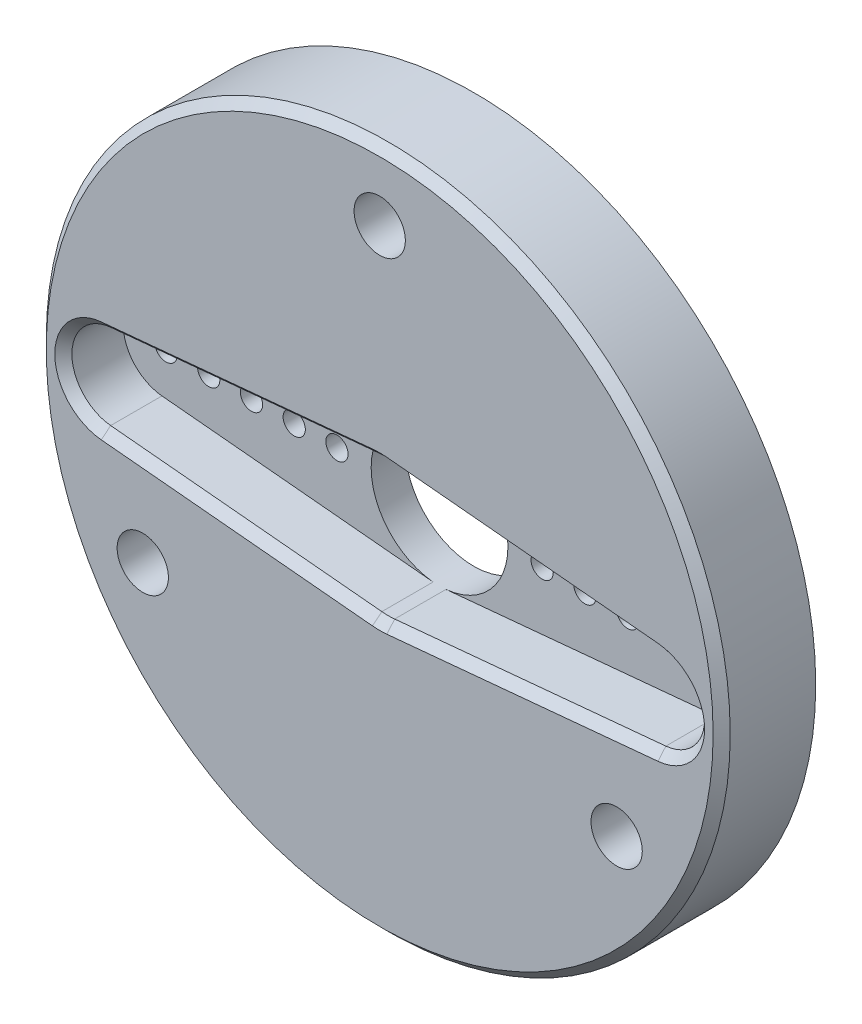
ISO-10303-21;
HEADER;
FILE_DESCRIPTION(('STEP AP214'),'2;1');
FILE_NAME('part.step','',(''),(''),'','','');
FILE_SCHEMA(('AUTOMOTIVE_DESIGN { 1 0 10303 214 1 1 1 1 }'));
ENDSEC;
DATA;
#1=APPLICATION_CONTEXT('core data for automotive mechanical design processes');
#2=APPLICATION_PROTOCOL_DEFINITION('international standard','automotive_design',2000,#1);
#3=PRODUCT_CONTEXT('',#1,'mechanical');
#4=PRODUCT('Part','Part','',(#3));
#5=PRODUCT_RELATED_PRODUCT_CATEGORY('part','',(#4));
#6=PRODUCT_DEFINITION_FORMATION('','',#4);
#7=PRODUCT_DEFINITION_CONTEXT('part definition',#1,'design');
#8=PRODUCT_DEFINITION('design','',#6,#7);
#9=PRODUCT_DEFINITION_SHAPE('','',#8);
#10=(LENGTH_UNIT() NAMED_UNIT(*) SI_UNIT(.MILLI.,.METRE.));
#11=(NAMED_UNIT(*) PLANE_ANGLE_UNIT() SI_UNIT($,.RADIAN.));
#12=(NAMED_UNIT(*) SI_UNIT($,.STERADIAN.) SOLID_ANGLE_UNIT());
#13=UNCERTAINTY_MEASURE_WITH_UNIT(LENGTH_MEASURE(1.E-05),#10,'distance_accuracy_value','');
#14=(GEOMETRIC_REPRESENTATION_CONTEXT(3) GLOBAL_UNCERTAINTY_ASSIGNED_CONTEXT((#13)) GLOBAL_UNIT_ASSIGNED_CONTEXT((#10,
#11,#12)) REPRESENTATION_CONTEXT('',''));
#15=CARTESIAN_POINT('',(0.,0.,0.));
#16=DIRECTION('',(0.,0.,1.));
#17=DIRECTION('',(1.,0.,0.));
#18=AXIS2_PLACEMENT_3D('',#15,#16,#17);
#19=CARTESIAN_POINT('',(0.,0.,5.5));
#20=DIRECTION('',(0.,0.,-1.));
#21=DIRECTION('',(-1.,0.,0.));
#22=AXIS2_PLACEMENT_3D('',#19,#20,#21);
#23=CYLINDRICAL_SURFACE('',#22,4.);
#24=CARTESIAN_POINT('',(0.,0.,0.));
#25=DIRECTION('',(0.,0.,1.));
#26=DIRECTION('',(1.,0.,0.));
#27=AXIS2_PLACEMENT_3D('',#24,#25,#26);
#28=CIRCLE('',#27,4.);
#29=CARTESIAN_POINT('',(4.,0.,0.));
#30=VERTEX_POINT('',#29);
#31=EDGE_CURVE('E248',#30,#30,#28,.T.);
#32=ORIENTED_EDGE('',*,*,#31,.F.);
#33=EDGE_LOOP('',(#32));
#34=FACE_BOUND('',#33,.T.);
#35=DIRECTION('',(0.,0.,1.));
#36=VECTOR('',#35,1.);
#37=CARTESIAN_POINT('',(-0.375000000000002,-3.9823830805185,2.));
#38=LINE('',#37,#36);
#39=CARTESIAN_POINT('',(-0.375000000000002,-3.9823830805185,2.));
#40=VERTEX_POINT('',#39);
#41=CARTESIAN_POINT('',(-0.375000000000002,-3.9823830805185,5.00000000000001));
#42=VERTEX_POINT('',#41);
#43=EDGE_CURVE('E139',#40,#42,#38,.T.);
#44=ORIENTED_EDGE('',*,*,#43,.T.);
#45=CARTESIAN_POINT('',(0.,0.,5.00000000000001));
#46=DIRECTION('',(0.,0.,1.));
#47=DIRECTION('',(1.,0.,0.));
#48=AXIS2_PLACEMENT_3D('',#45,#46,#47);
#49=CIRCLE('',#48,4.);
#50=CARTESIAN_POINT('',(0.375,-3.9823830805185,5.00000000000001));
#51=VERTEX_POINT('',#50);
#52=EDGE_CURVE('E292',#42,#51,#49,.T.);
#53=ORIENTED_EDGE('',*,*,#52,.T.);
#54=DIRECTION('',(0.,0.,1.));
#55=VECTOR('',#54,1.);
#56=CARTESIAN_POINT('',(0.375,-3.9823830805185,2.));
#57=LINE('',#56,#55);
#58=CARTESIAN_POINT('',(0.375,-3.9823830805185,2.));
#59=VERTEX_POINT('',#58);
#60=EDGE_CURVE('E183',#59,#51,#57,.T.);
#61=ORIENTED_EDGE('',*,*,#60,.F.);
#62=CARTESIAN_POINT('',(0.,0.,2.));
#63=DIRECTION('',(0.,0.,1.));
#64=DIRECTION('',(1.,0.,0.));
#65=AXIS2_PLACEMENT_3D('',#62,#63,#64);
#66=CIRCLE('',#65,4.);
#67=CARTESIAN_POINT('',(0.375,3.9823830805185,2.));
#68=VERTEX_POINT('',#67);
#69=EDGE_CURVE('E214',#59,#68,#66,.T.);
#70=ORIENTED_EDGE('',*,*,#69,.T.);
#71=DIRECTION('',(0.,0.,1.));
#72=VECTOR('',#71,1.);
#73=CARTESIAN_POINT('',(0.375,3.9823830805185,2.));
#74=LINE('',#73,#72);
#75=CARTESIAN_POINT('',(0.375,3.9823830805185,5.00000000000001));
#76=VERTEX_POINT('',#75);
#77=EDGE_CURVE('E174',#68,#76,#74,.T.);
#78=ORIENTED_EDGE('',*,*,#77,.T.);
#79=CARTESIAN_POINT('',(0.,0.,5.00000000000001));
#80=DIRECTION('',(0.,0.,1.));
#81=DIRECTION('',(1.,0.,0.));
#82=AXIS2_PLACEMENT_3D('',#79,#80,#81);
#83=CIRCLE('',#82,4.);
#84=CARTESIAN_POINT('',(-0.375,3.9823830805185,5.00000000000001));
#85=VERTEX_POINT('',#84);
#86=EDGE_CURVE('E290',#76,#85,#83,.T.);
#87=ORIENTED_EDGE('',*,*,#86,.T.);
#88=DIRECTION('',(0.,0.,1.));
#89=VECTOR('',#88,1.);
#90=CARTESIAN_POINT('',(-0.375,3.9823830805185,2.));
#91=LINE('',#90,#89);
#92=CARTESIAN_POINT('',(-0.375,3.9823830805185,2.));
#93=VERTEX_POINT('',#92);
#94=EDGE_CURVE('E172',#93,#85,#91,.T.);
#95=ORIENTED_EDGE('',*,*,#94,.F.);
#96=EDGE_CURVE('E217',#93,#40,#66,.T.);
#97=ORIENTED_EDGE('',*,*,#96,.T.);
#98=EDGE_LOOP('',(#44,#53,#61,#70,#78,#87,#95,#97));
#99=FACE_BOUND('',#98,.T.);
#100=ADVANCED_FACE('F43',(#34,#99),#23,.F.);
#101=CARTESIAN_POINT('',(6.,0.,5.5));
#102=DIRECTION('',(0.,0.,-1.));
#103=DIRECTION('',(-1.,0.,0.));
#104=AXIS2_PLACEMENT_3D('',#101,#102,#103);
#105=CYLINDRICAL_SURFACE('',#104,0.65);
#106=CARTESIAN_POINT('',(6.,0.,0.));
#107=DIRECTION('',(0.,0.,1.));
#108=DIRECTION('',(1.,0.,0.));
#109=AXIS2_PLACEMENT_3D('',#106,#107,#108);
#110=CIRCLE('',#109,0.65);
#111=CARTESIAN_POINT('',(6.65,0.,0.));
#112=VERTEX_POINT('',#111);
#113=EDGE_CURVE('E245',#112,#112,#110,.T.);
#114=ORIENTED_EDGE('',*,*,#113,.F.);
#115=EDGE_LOOP('',(#114));
#116=FACE_BOUND('',#115,.T.);
#117=CARTESIAN_POINT('',(6.,0.,2.));
#118=DIRECTION('',(0.,0.,1.));
#119=DIRECTION('',(1.,0.,0.));
#120=AXIS2_PLACEMENT_3D('',#117,#118,#119);
#121=CIRCLE('',#120,0.65);
#122=CARTESIAN_POINT('',(6.65,0.,2.));
#123=VERTEX_POINT('',#122);
#124=EDGE_CURVE('E211',#123,#123,#121,.T.);
#125=ORIENTED_EDGE('',*,*,#124,.T.);
#126=EDGE_LOOP('',(#125));
#127=FACE_BOUND('',#126,.T.);
#128=ADVANCED_FACE('F360',(#116,#127),#105,.F.);
#129=CARTESIAN_POINT('',(8.5,0.,5.5));
#130=DIRECTION('',(0.,0.,-1.));
#131=DIRECTION('',(-1.,0.,0.));
#132=AXIS2_PLACEMENT_3D('',#129,#130,#131);
#133=CYLINDRICAL_SURFACE('',#132,0.649999999999999);
#134=CARTESIAN_POINT('',(8.5,0.,0.));
#135=DIRECTION('',(0.,0.,1.));
#136=DIRECTION('',(1.,0.,0.));
#137=AXIS2_PLACEMENT_3D('',#134,#135,#136);
#138=CIRCLE('',#137,0.649999999999999);
#139=CARTESIAN_POINT('',(9.15,0.,0.));
#140=VERTEX_POINT('',#139);
#141=EDGE_CURVE('E242',#140,#140,#138,.T.);
#142=ORIENTED_EDGE('',*,*,#141,.F.);
#143=EDGE_LOOP('',(#142));
#144=FACE_BOUND('',#143,.T.);
#145=CARTESIAN_POINT('',(8.5,0.,2.));
#146=DIRECTION('',(0.,0.,1.));
#147=DIRECTION('',(1.,0.,0.));
#148=AXIS2_PLACEMENT_3D('',#145,#146,#147);
#149=CIRCLE('',#148,0.649999999999999);
#150=CARTESIAN_POINT('',(9.15,0.,2.));
#151=VERTEX_POINT('',#150);
#152=EDGE_CURVE('E208',#151,#151,#149,.T.);
#153=ORIENTED_EDGE('',*,*,#152,.T.);
#154=EDGE_LOOP('',(#153));
#155=FACE_BOUND('',#154,.T.);
#156=ADVANCED_FACE('F366',(#144,#155),#133,.F.);
#157=CARTESIAN_POINT('',(11.,0.,5.5));
#158=DIRECTION('',(0.,0.,-1.));
#159=DIRECTION('',(-1.,0.,0.));
#160=AXIS2_PLACEMENT_3D('',#157,#158,#159);
#161=CYLINDRICAL_SURFACE('',#160,0.650000000000001);
#162=CARTESIAN_POINT('',(11.,0.,0.));
#163=DIRECTION('',(0.,0.,1.));
#164=DIRECTION('',(1.,0.,0.));
#165=AXIS2_PLACEMENT_3D('',#162,#163,#164);
#166=CIRCLE('',#165,0.650000000000001);
#167=CARTESIAN_POINT('',(11.65,0.,0.));
#168=VERTEX_POINT('',#167);
#169=EDGE_CURVE('E239',#168,#168,#166,.T.);
#170=ORIENTED_EDGE('',*,*,#169,.F.);
#171=EDGE_LOOP('',(#170));
#172=FACE_BOUND('',#171,.T.);
#173=CARTESIAN_POINT('',(11.,0.,2.));
#174=DIRECTION('',(0.,0.,1.));
#175=DIRECTION('',(1.,0.,0.));
#176=AXIS2_PLACEMENT_3D('',#173,#174,#175);
#177=CIRCLE('',#176,0.650000000000001);
#178=CARTESIAN_POINT('',(11.65,0.,2.));
#179=VERTEX_POINT('',#178);
#180=EDGE_CURVE('E205',#179,#179,#177,.T.);
#181=ORIENTED_EDGE('',*,*,#180,.T.);
#182=EDGE_LOOP('',(#181));
#183=FACE_BOUND('',#182,.T.);
#184=ADVANCED_FACE('F374',(#172,#183),#161,.F.);
#185=CARTESIAN_POINT('',(13.5,0.,5.5));
#186=DIRECTION('',(0.,0.,-1.));
#187=DIRECTION('',(-1.,0.,0.));
#188=AXIS2_PLACEMENT_3D('',#185,#186,#187);
#189=CYLINDRICAL_SURFACE('',#188,0.649999999999999);
#190=CARTESIAN_POINT('',(13.5,0.,0.));
#191=DIRECTION('',(0.,0.,1.));
#192=DIRECTION('',(1.,0.,0.));
#193=AXIS2_PLACEMENT_3D('',#190,#191,#192);
#194=CIRCLE('',#193,0.649999999999999);
#195=CARTESIAN_POINT('',(14.15,0.,0.));
#196=VERTEX_POINT('',#195);
#197=EDGE_CURVE('E236',#196,#196,#194,.T.);
#198=ORIENTED_EDGE('',*,*,#197,.F.);
#199=EDGE_LOOP('',(#198));
#200=FACE_BOUND('',#199,.T.);
#201=CARTESIAN_POINT('',(13.5,0.,2.));
#202=DIRECTION('',(0.,0.,1.));
#203=DIRECTION('',(1.,0.,0.));
#204=AXIS2_PLACEMENT_3D('',#201,#202,#203);
#205=CIRCLE('',#204,0.649999999999999);
#206=CARTESIAN_POINT('',(14.15,0.,2.));
#207=VERTEX_POINT('',#206);
#208=EDGE_CURVE('E202',#207,#207,#205,.T.);
#209=ORIENTED_EDGE('',*,*,#208,.T.);
#210=EDGE_LOOP('',(#209));
#211=FACE_BOUND('',#210,.T.);
#212=ADVANCED_FACE('F378',(#200,#211),#189,.F.);
#213=CARTESIAN_POINT('',(16.,0.,5.5));
#214=DIRECTION('',(0.,0.,-1.));
#215=DIRECTION('',(-1.,0.,0.));
#216=AXIS2_PLACEMENT_3D('',#213,#214,#215);
#217=CYLINDRICAL_SURFACE('',#216,0.650000000000001);
#218=CARTESIAN_POINT('',(16.,0.,0.));
#219=DIRECTION('',(0.,0.,1.));
#220=DIRECTION('',(1.,0.,0.));
#221=AXIS2_PLACEMENT_3D('',#218,#219,#220);
#222=CIRCLE('',#221,0.650000000000001);
#223=CARTESIAN_POINT('',(16.65,0.,0.));
#224=VERTEX_POINT('',#223);
#225=EDGE_CURVE('E233',#224,#224,#222,.T.);
#226=ORIENTED_EDGE('',*,*,#225,.F.);
#227=EDGE_LOOP('',(#226));
#228=FACE_BOUND('',#227,.T.);
#229=CARTESIAN_POINT('',(16.,0.,2.));
#230=DIRECTION('',(0.,0.,1.));
#231=DIRECTION('',(1.,0.,0.));
#232=AXIS2_PLACEMENT_3D('',#229,#230,#231);
#233=CIRCLE('',#232,0.650000000000001);
#234=CARTESIAN_POINT('',(16.65,0.,2.));
#235=VERTEX_POINT('',#234);
#236=EDGE_CURVE('E199',#235,#235,#233,.T.);
#237=ORIENTED_EDGE('',*,*,#236,.T.);
#238=EDGE_LOOP('',(#237));
#239=FACE_BOUND('',#238,.T.);
#240=ADVANCED_FACE('F382',(#228,#239),#217,.F.);
#241=CARTESIAN_POINT('',(-16.,0.,5.5));
#242=DIRECTION('',(0.,0.,-1.));
#243=DIRECTION('',(-1.,0.,0.));
#244=AXIS2_PLACEMENT_3D('',#241,#242,#243);
#245=CYLINDRICAL_SURFACE('',#244,0.650000000000001);
#246=CARTESIAN_POINT('',(-16.,0.,0.));
#247=DIRECTION('',(0.,0.,1.));
#248=DIRECTION('',(-1.,0.,0.));
#249=AXIS2_PLACEMENT_3D('',#246,#247,#248);
#250=CIRCLE('',#249,0.650000000000001);
#251=CARTESIAN_POINT('',(-16.65,0.,0.));
#252=VERTEX_POINT('',#251);
#253=EDGE_CURVE('E230',#252,#252,#250,.T.);
#254=ORIENTED_EDGE('',*,*,#253,.F.);
#255=EDGE_LOOP('',(#254));
#256=FACE_BOUND('',#255,.T.);
#257=CARTESIAN_POINT('',(-16.,0.,2.));
#258=DIRECTION('',(0.,0.,1.));
#259=DIRECTION('',(1.,0.,0.));
#260=AXIS2_PLACEMENT_3D('',#257,#258,#259);
#261=CIRCLE('',#260,0.650000000000001);
#262=CARTESIAN_POINT('',(-15.35,0.,2.));
#263=VERTEX_POINT('',#262);
#264=EDGE_CURVE('E196',#263,#263,#261,.T.);
#265=ORIENTED_EDGE('',*,*,#264,.T.);
#266=EDGE_LOOP('',(#265));
#267=FACE_BOUND('',#266,.T.);
#268=ADVANCED_FACE('F386',(#256,#267),#245,.F.);
#269=CARTESIAN_POINT('',(-13.5,0.,5.5));
#270=DIRECTION('',(0.,0.,-1.));
#271=DIRECTION('',(-1.,0.,0.));
#272=AXIS2_PLACEMENT_3D('',#269,#270,#271);
#273=CYLINDRICAL_SURFACE('',#272,0.649999999999999);
#274=CARTESIAN_POINT('',(-13.5,0.,0.));
#275=DIRECTION('',(0.,0.,1.));
#276=DIRECTION('',(-1.,0.,0.));
#277=AXIS2_PLACEMENT_3D('',#274,#275,#276);
#278=CIRCLE('',#277,0.649999999999999);
#279=CARTESIAN_POINT('',(-14.15,0.,0.));
#280=VERTEX_POINT('',#279);
#281=EDGE_CURVE('E227',#280,#280,#278,.T.);
#282=ORIENTED_EDGE('',*,*,#281,.F.);
#283=EDGE_LOOP('',(#282));
#284=FACE_BOUND('',#283,.T.);
#285=CARTESIAN_POINT('',(-13.5,0.,2.));
#286=DIRECTION('',(0.,0.,1.));
#287=DIRECTION('',(1.,0.,0.));
#288=AXIS2_PLACEMENT_3D('',#285,#286,#287);
#289=CIRCLE('',#288,0.649999999999999);
#290=CARTESIAN_POINT('',(-12.85,0.,2.));
#291=VERTEX_POINT('',#290);
#292=EDGE_CURVE('E193',#291,#291,#289,.T.);
#293=ORIENTED_EDGE('',*,*,#292,.T.);
#294=EDGE_LOOP('',(#293));
#295=FACE_BOUND('',#294,.T.);
#296=ADVANCED_FACE('F390',(#284,#295),#273,.F.);
#297=CARTESIAN_POINT('',(-11.,0.,5.5));
#298=DIRECTION('',(0.,0.,-1.));
#299=DIRECTION('',(-1.,0.,0.));
#300=AXIS2_PLACEMENT_3D('',#297,#298,#299);
#301=CYLINDRICAL_SURFACE('',#300,0.650000000000001);
#302=CARTESIAN_POINT('',(-11.,0.,0.));
#303=DIRECTION('',(0.,0.,1.));
#304=DIRECTION('',(-1.,0.,0.));
#305=AXIS2_PLACEMENT_3D('',#302,#303,#304);
#306=CIRCLE('',#305,0.650000000000001);
#307=CARTESIAN_POINT('',(-11.65,0.,0.));
#308=VERTEX_POINT('',#307);
#309=EDGE_CURVE('E224',#308,#308,#306,.T.);
#310=ORIENTED_EDGE('',*,*,#309,.F.);
#311=EDGE_LOOP('',(#310));
#312=FACE_BOUND('',#311,.T.);
#313=CARTESIAN_POINT('',(-11.,0.,2.));
#314=DIRECTION('',(0.,0.,1.));
#315=DIRECTION('',(1.,0.,0.));
#316=AXIS2_PLACEMENT_3D('',#313,#314,#315);
#317=CIRCLE('',#316,0.650000000000001);
#318=CARTESIAN_POINT('',(-10.35,0.,2.));
#319=VERTEX_POINT('',#318);
#320=EDGE_CURVE('E190',#319,#319,#317,.T.);
#321=ORIENTED_EDGE('',*,*,#320,.T.);
#322=EDGE_LOOP('',(#321));
#323=FACE_BOUND('',#322,.T.);
#324=ADVANCED_FACE('F394',(#312,#323),#301,.F.);
#325=CARTESIAN_POINT('',(-8.5,0.,5.5));
#326=DIRECTION('',(0.,0.,-1.));
#327=DIRECTION('',(-1.,0.,0.));
#328=AXIS2_PLACEMENT_3D('',#325,#326,#327);
#329=CYLINDRICAL_SURFACE('',#328,0.649999999999999);
#330=CARTESIAN_POINT('',(-8.5,0.,0.));
#331=DIRECTION('',(0.,0.,1.));
#332=DIRECTION('',(-1.,0.,0.));
#333=AXIS2_PLACEMENT_3D('',#330,#331,#332);
#334=CIRCLE('',#333,0.649999999999999);
#335=CARTESIAN_POINT('',(-9.15,0.,0.));
#336=VERTEX_POINT('',#335);
#337=EDGE_CURVE('E221',#336,#336,#334,.T.);
#338=ORIENTED_EDGE('',*,*,#337,.F.);
#339=EDGE_LOOP('',(#338));
#340=FACE_BOUND('',#339,.T.);
#341=CARTESIAN_POINT('',(-8.5,0.,2.));
#342=DIRECTION('',(0.,0.,1.));
#343=DIRECTION('',(1.,0.,0.));
#344=AXIS2_PLACEMENT_3D('',#341,#342,#343);
#345=CIRCLE('',#344,0.649999999999999);
#346=CARTESIAN_POINT('',(-7.85,0.,2.));
#347=VERTEX_POINT('',#346);
#348=EDGE_CURVE('E187',#347,#347,#345,.T.);
#349=ORIENTED_EDGE('',*,*,#348,.T.);
#350=EDGE_LOOP('',(#349));
#351=FACE_BOUND('',#350,.T.);
#352=ADVANCED_FACE('F355',(#340,#351),#329,.F.);
#353=CARTESIAN_POINT('',(-6.,0.,5.5));
#354=DIRECTION('',(0.,0.,-1.));
#355=DIRECTION('',(-1.,0.,0.));
#356=AXIS2_PLACEMENT_3D('',#353,#354,#355);
#357=CYLINDRICAL_SURFACE('',#356,0.65);
#358=CARTESIAN_POINT('',(-6.,0.,0.));
#359=DIRECTION('',(0.,0.,1.));
#360=DIRECTION('',(-1.,0.,0.));
#361=AXIS2_PLACEMENT_3D('',#358,#359,#360);
#362=CIRCLE('',#361,0.65);
#363=CARTESIAN_POINT('',(-6.65,0.,0.));
#364=VERTEX_POINT('',#363);
#365=EDGE_CURVE('E218',#364,#364,#362,.T.);
#366=ORIENTED_EDGE('',*,*,#365,.F.);
#367=EDGE_LOOP('',(#366));
#368=FACE_BOUND('',#367,.T.);
#369=CARTESIAN_POINT('',(-6.,0.,2.));
#370=DIRECTION('',(0.,0.,1.));
#371=DIRECTION('',(1.,0.,0.));
#372=AXIS2_PLACEMENT_3D('',#369,#370,#371);
#373=CIRCLE('',#372,0.65);
#374=CARTESIAN_POINT('',(-5.35,0.,2.));
#375=VERTEX_POINT('',#374);
#376=EDGE_CURVE('E171',#375,#375,#373,.T.);
#377=ORIENTED_EDGE('',*,*,#376,.T.);
#378=EDGE_LOOP('',(#377));
#379=FACE_BOUND('',#378,.T.);
#380=ADVANCED_FACE('F342',(#368,#379),#357,.F.);
#381=CARTESIAN_POINT('',(0.,0.,5.5));
#382=DIRECTION('',(0.,0.,1.));
#383=DIRECTION('',(1.,0.,0.));
#384=AXIS2_PLACEMENT_3D('',#381,#382,#383);
#385=PLANE('',#384);
#386=CARTESIAN_POINT('',(16.,0.,5.5));
#387=DIRECTION('',(0.,0.,1.));
#388=DIRECTION('',(1.,0.,0.));
#389=AXIS2_PLACEMENT_3D('',#386,#387,#388);
#390=CIRCLE('',#389,2.99999999999999);
#391=CARTESIAN_POINT('',(16.28125,2.98678731038887,5.5));
#392=VERTEX_POINT('',#391);
#393=CARTESIAN_POINT('',(16.28125,-2.98678731038887,5.5));
#394=VERTEX_POINT('',#393);
#395=EDGE_CURVE('E283',#392,#394,#390,.F.);
#396=ORIENTED_EDGE('',*,*,#395,.T.);
#397=DIRECTION('',(-0.995595770129625,-0.0937500000000001,0.));
#398=VECTOR('',#397,1.);
#399=CARTESIAN_POINT('',(0.421875,-4.48018096558331,5.5));
#400=LINE('',#399,#398);
#401=CARTESIAN_POINT('',(0.421875,-4.48018096558331,5.5));
#402=VERTEX_POINT('',#401);
#403=EDGE_CURVE('E285',#394,#402,#400,.T.);
#404=ORIENTED_EDGE('',*,*,#403,.T.);
#405=CARTESIAN_POINT('',(0.,0.,5.5));
#406=DIRECTION('',(0.,0.,1.));
#407=DIRECTION('',(1.,0.,0.));
#408=AXIS2_PLACEMENT_3D('',#405,#406,#407);
#409=CIRCLE('',#408,4.5);
#410=CARTESIAN_POINT('',(-0.421875000000001,-4.48018096558331,5.5));
#411=VERTEX_POINT('',#410);
#412=EDGE_CURVE('E281',#402,#411,#409,.F.);
#413=ORIENTED_EDGE('',*,*,#412,.T.);
#414=DIRECTION('',(-0.995595770129625,0.0937500000000001,0.));
#415=VECTOR('',#414,1.);
#416=CARTESIAN_POINT('',(-16.28125,-2.98678731038887,5.5));
#417=LINE('',#416,#415);
#418=CARTESIAN_POINT('',(-16.28125,-2.98678731038887,5.5));
#419=VERTEX_POINT('',#418);
#420=EDGE_CURVE('E277',#411,#419,#417,.T.);
#421=ORIENTED_EDGE('',*,*,#420,.T.);
#422=CARTESIAN_POINT('',(-16.,0.,5.5));
#423=DIRECTION('',(0.,0.,1.));
#424=DIRECTION('',(1.,0.,0.));
#425=AXIS2_PLACEMENT_3D('',#422,#423,#424);
#426=CIRCLE('',#425,2.99999999999999);
#427=CARTESIAN_POINT('',(-16.28125,2.98678731038887,5.5));
#428=VERTEX_POINT('',#427);
#429=EDGE_CURVE('E273',#419,#428,#426,.F.);
#430=ORIENTED_EDGE('',*,*,#429,.T.);
#431=DIRECTION('',(0.995595770129625,0.0937500000000001,0.));
#432=VECTOR('',#431,1.);
#433=CARTESIAN_POINT('',(-0.421875,4.48018096558331,5.5));
#434=LINE('',#433,#432);
#435=CARTESIAN_POINT('',(-0.421875,4.48018096558331,5.5));
#436=VERTEX_POINT('',#435);
#437=EDGE_CURVE('E271',#428,#436,#434,.T.);
#438=ORIENTED_EDGE('',*,*,#437,.T.);
#439=CARTESIAN_POINT('',(0.,0.,5.5));
#440=DIRECTION('',(0.,0.,1.));
#441=DIRECTION('',(1.,0.,0.));
#442=AXIS2_PLACEMENT_3D('',#439,#440,#441);
#443=CIRCLE('',#442,4.5);
#444=CARTESIAN_POINT('',(0.421875,4.48018096558331,5.5));
#445=VERTEX_POINT('',#444);
#446=EDGE_CURVE('E275',#436,#445,#443,.F.);
#447=ORIENTED_EDGE('',*,*,#446,.T.);
#448=DIRECTION('',(0.995595770129625,-0.0937500000000001,0.));
#449=VECTOR('',#448,1.);
#450=CARTESIAN_POINT('',(16.28125,2.98678731038887,5.5));
#451=LINE('',#450,#449);
#452=EDGE_CURVE('E279',#445,#392,#451,.T.);
#453=ORIENTED_EDGE('',*,*,#452,.T.);
#454=EDGE_LOOP('',(#396,#404,#413,#421,#430,#438,#447,#453));
#455=FACE_BOUND('',#454,.T.);
#456=CARTESIAN_POINT('',(0.,0.,5.5));
#457=DIRECTION('',(0.,0.,1.));
#458=DIRECTION('',(1.,0.,0.));
#459=AXIS2_PLACEMENT_3D('',#456,#457,#458);
#460=CIRCLE('',#459,19.5);
#461=CARTESIAN_POINT('',(19.5,0.,5.5));
#462=VERTEX_POINT('',#461);
#463=EDGE_CURVE('E254',#462,#462,#460,.T.);
#464=ORIENTED_EDGE('',*,*,#463,.T.);
#465=EDGE_LOOP('',(#464));
#466=FACE_BOUND('',#465,.T.);
#467=CARTESIAN_POINT('',(0.,16.,5.5));
#468=DIRECTION('',(0.,0.,1.));
#469=DIRECTION('',(1.,0.,0.));
#470=AXIS2_PLACEMENT_3D('',#467,#468,#469);
#471=CIRCLE('',#470,1.5);
#472=CARTESIAN_POINT('',(1.5,16.,5.5));
#473=VERTEX_POINT('',#472);
#474=EDGE_CURVE('E260',#473,#473,#471,.T.);
#475=ORIENTED_EDGE('',*,*,#474,.F.);
#476=EDGE_LOOP('',(#475));
#477=FACE_BOUND('',#476,.T.);
#478=CARTESIAN_POINT('',(13.8564064605521,-7.99999999999939,5.5));
#479=DIRECTION('',(0.,0.,1.));
#480=DIRECTION('',(1.,0.,0.));
#481=AXIS2_PLACEMENT_3D('',#478,#479,#480);
#482=CIRCLE('',#481,1.5);
#483=CARTESIAN_POINT('',(15.3564064605521,-7.99999999999939,5.5));
#484=VERTEX_POINT('',#483);
#485=EDGE_CURVE('E325',#484,#484,#482,.T.);
#486=ORIENTED_EDGE('',*,*,#485,.F.);
#487=EDGE_LOOP('',(#486));
#488=FACE_BOUND('',#487,.T.);
#489=CARTESIAN_POINT('',(-13.85640646055,-8.00000000000061,5.5));
#490=DIRECTION('',(0.,0.,1.));
#491=DIRECTION('',(1.,0.,0.));
#492=AXIS2_PLACEMENT_3D('',#489,#490,#491);
#493=CIRCLE('',#492,1.5);
#494=CARTESIAN_POINT('',(-12.35640646055,-8.00000000000061,5.5));
#495=VERTEX_POINT('',#494);
#496=EDGE_CURVE('E158',#495,#495,#493,.T.);
#497=ORIENTED_EDGE('',*,*,#496,.F.);
#498=EDGE_LOOP('',(#497));
#499=FACE_BOUND('',#498,.T.);
#500=ADVANCED_FACE('F338',(#455,#466,#477,#488,#499),#385,.T.);
#501=CARTESIAN_POINT('',(0.,0.,0.));
#502=DIRECTION('',(0.,0.,1.));
#503=DIRECTION('',(1.,0.,0.));
#504=AXIS2_PLACEMENT_3D('',#501,#502,#503);
#505=PLANE('',#504);
#506=CARTESIAN_POINT('',(0.,16.,0.));
#507=DIRECTION('',(0.,0.,1.));
#508=DIRECTION('',(1.,0.,0.));
#509=AXIS2_PLACEMENT_3D('',#506,#507,#508);
#510=CIRCLE('',#509,1.5);
#511=CARTESIAN_POINT('',(1.5,16.,0.));
#512=VERTEX_POINT('',#511);
#513=EDGE_CURVE('E152',#512,#512,#510,.T.);
#514=ORIENTED_EDGE('',*,*,#513,.T.);
#515=EDGE_LOOP('',(#514));
#516=FACE_BOUND('',#515,.T.);
#517=CARTESIAN_POINT('',(13.8564064605521,-7.99999999999939,0.));
#518=DIRECTION('',(0.,0.,1.));
#519=DIRECTION('',(1.,0.,0.));
#520=AXIS2_PLACEMENT_3D('',#517,#518,#519);
#521=CIRCLE('',#520,1.5);
#522=CARTESIAN_POINT('',(15.3564064605521,-7.99999999999939,0.));
#523=VERTEX_POINT('',#522);
#524=EDGE_CURVE('E155',#523,#523,#521,.T.);
#525=ORIENTED_EDGE('',*,*,#524,.T.);
#526=EDGE_LOOP('',(#525));
#527=FACE_BOUND('',#526,.T.);
#528=CARTESIAN_POINT('',(-13.85640646055,-8.00000000000061,0.));
#529=DIRECTION('',(0.,0.,1.));
#530=DIRECTION('',(1.,0.,0.));
#531=AXIS2_PLACEMENT_3D('',#528,#529,#530);
#532=CIRCLE('',#531,1.5);
#533=CARTESIAN_POINT('',(-12.35640646055,-8.00000000000061,0.));
#534=VERTEX_POINT('',#533);
#535=EDGE_CURVE('E257',#534,#534,#532,.T.);
#536=ORIENTED_EDGE('',*,*,#535,.T.);
#537=EDGE_LOOP('',(#536));
#538=FACE_BOUND('',#537,.T.);
#539=CARTESIAN_POINT('',(0.,0.,0.));
#540=DIRECTION('',(0.,0.,1.));
#541=DIRECTION('',(1.,0.,0.));
#542=AXIS2_PLACEMENT_3D('',#539,#540,#541);
#543=CIRCLE('',#542,20.);
#544=CARTESIAN_POINT('',(20.,0.,0.));
#545=VERTEX_POINT('',#544);
#546=EDGE_CURVE('E251',#545,#545,#543,.T.);
#547=ORIENTED_EDGE('',*,*,#546,.F.);
#548=EDGE_LOOP('',(#547));
#549=FACE_BOUND('',#548,.T.);
#550=ORIENTED_EDGE('',*,*,#31,.T.);
#551=EDGE_LOOP('',(#550));
#552=FACE_BOUND('',#551,.T.);
#553=ORIENTED_EDGE('',*,*,#113,.T.);
#554=EDGE_LOOP('',(#553));
#555=FACE_BOUND('',#554,.T.);
#556=ORIENTED_EDGE('',*,*,#141,.T.);
#557=EDGE_LOOP('',(#556));
#558=FACE_BOUND('',#557,.T.);
#559=ORIENTED_EDGE('',*,*,#169,.T.);
#560=EDGE_LOOP('',(#559));
#561=FACE_BOUND('',#560,.T.);
#562=ORIENTED_EDGE('',*,*,#197,.T.);
#563=EDGE_LOOP('',(#562));
#564=FACE_BOUND('',#563,.T.);
#565=ORIENTED_EDGE('',*,*,#225,.T.);
#566=EDGE_LOOP('',(#565));
#567=FACE_BOUND('',#566,.T.);
#568=ORIENTED_EDGE('',*,*,#253,.T.);
#569=EDGE_LOOP('',(#568));
#570=FACE_BOUND('',#569,.T.);
#571=ORIENTED_EDGE('',*,*,#281,.T.);
#572=EDGE_LOOP('',(#571));
#573=FACE_BOUND('',#572,.T.);
#574=ORIENTED_EDGE('',*,*,#309,.T.);
#575=EDGE_LOOP('',(#574));
#576=FACE_BOUND('',#575,.T.);
#577=ORIENTED_EDGE('',*,*,#337,.T.);
#578=EDGE_LOOP('',(#577));
#579=FACE_BOUND('',#578,.T.);
#580=ORIENTED_EDGE('',*,*,#365,.T.);
#581=EDGE_LOOP('',(#580));
#582=FACE_BOUND('',#581,.T.);
#583=ADVANCED_FACE('F341',(#516,#527,#538,#549,#552,#555,#558,#561,#564,#567,#570,#573,#576,
#579,#582),#505,.F.);
#584=CARTESIAN_POINT('',(0.,0.,5.5));
#585=DIRECTION('',(0.,0.,-1.));
#586=DIRECTION('',(-1.,0.,0.));
#587=AXIS2_PLACEMENT_3D('',#584,#585,#586);
#588=CYLINDRICAL_SURFACE('',#587,20.);
#589=CARTESIAN_POINT('',(0.,0.,5.));
#590=DIRECTION('',(0.,0.,1.));
#591=DIRECTION('',(1.,0.,0.));
#592=AXIS2_PLACEMENT_3D('',#589,#590,#591);
#593=CIRCLE('',#592,20.);
#594=CARTESIAN_POINT('',(20.,0.,5.));
#595=VERTEX_POINT('',#594);
#596=EDGE_CURVE('E265',#595,#595,#593,.F.);
#597=ORIENTED_EDGE('',*,*,#596,.T.);
#598=EDGE_LOOP('',(#597));
#599=FACE_BOUND('',#598,.T.);
#600=ORIENTED_EDGE('',*,*,#546,.T.);
#601=EDGE_LOOP('',(#600));
#602=FACE_BOUND('',#601,.T.);
#603=ADVANCED_FACE('F351',(#599,#602),#588,.T.);
#604=CARTESIAN_POINT('',(-16.,0.,2.));
#605=DIRECTION('',(0.,0.,1.));
#606=DIRECTION('',(1.,0.,0.));
#607=AXIS2_PLACEMENT_3D('',#604,#605,#606);
#608=PLANE('',#607);
#609=ORIENTED_EDGE('',*,*,#376,.F.);
#610=EDGE_LOOP('',(#609));
#611=FACE_BOUND('',#610,.T.);
#612=ORIENTED_EDGE('',*,*,#348,.F.);
#613=EDGE_LOOP('',(#612));
#614=FACE_BOUND('',#613,.T.);
#615=ORIENTED_EDGE('',*,*,#320,.F.);
#616=EDGE_LOOP('',(#615));
#617=FACE_BOUND('',#616,.T.);
#618=ORIENTED_EDGE('',*,*,#292,.F.);
#619=EDGE_LOOP('',(#618));
#620=FACE_BOUND('',#619,.T.);
#621=ORIENTED_EDGE('',*,*,#264,.F.);
#622=EDGE_LOOP('',(#621));
#623=FACE_BOUND('',#622,.T.);
#624=DIRECTION('',(-0.995595770129625,-0.0937500000000001,0.));
#625=VECTOR('',#624,1.);
#626=CARTESIAN_POINT('',(-16.234375,2.48898942532406,2.));
#627=LINE('',#626,#625);
#628=CARTESIAN_POINT('',(-16.234375,2.48898942532406,2.));
#629=VERTEX_POINT('',#628);
#630=EDGE_CURVE('E140',#93,#629,#627,.T.);
#631=ORIENTED_EDGE('',*,*,#630,.T.);
#632=CARTESIAN_POINT('',(-16.,0.,2.));
#633=DIRECTION('',(0.,0.,1.));
#634=DIRECTION('',(1.,0.,0.));
#635=AXIS2_PLACEMENT_3D('',#632,#633,#634);
#636=CIRCLE('',#635,2.5);
#637=CARTESIAN_POINT('',(-16.234375,-2.48898942532406,2.));
#638=VERTEX_POINT('',#637);
#639=EDGE_CURVE('E135',#629,#638,#636,.T.);
#640=ORIENTED_EDGE('',*,*,#639,.T.);
#641=DIRECTION('',(0.995595770129625,-0.0937500000000001,0.));
#642=VECTOR('',#641,1.);
#643=CARTESIAN_POINT('',(-16.234375,-2.48898942532406,2.));
#644=LINE('',#643,#642);
#645=EDGE_CURVE('E143',#638,#40,#644,.T.);
#646=ORIENTED_EDGE('',*,*,#645,.T.);
#647=ORIENTED_EDGE('',*,*,#96,.F.);
#648=EDGE_LOOP('',(#631,#640,#646,#647));
#649=FACE_BOUND('',#648,.T.);
#650=ADVANCED_FACE('F150',(#611,#614,#617,#620,#623,#649),#608,.T.);
#651=CARTESIAN_POINT('',(-16.234375,-2.48898942532406,2.));
#652=DIRECTION('',(-0.09375,-0.995595770129624,0.));
#653=DIRECTION('',(0.995595770129625,-0.0937500000000001,0.));
#654=AXIS2_PLACEMENT_3D('',#651,#652,#653);
#655=PLANE('',#654);
#656=DIRECTION('',(0.,0.,1.));
#657=VECTOR('',#656,1.);
#658=CARTESIAN_POINT('',(-16.234375,-2.48898942532406,2.));
#659=LINE('',#658,#657);
#660=CARTESIAN_POINT('',(-16.234375,-2.48898942532406,5.00000000000001));
#661=VERTEX_POINT('',#660);
#662=EDGE_CURVE('E131',#638,#661,#659,.T.);
#663=ORIENTED_EDGE('',*,*,#662,.T.);
#664=DIRECTION('',(0.995595770129625,-0.0937500000000001,0.));
#665=VECTOR('',#664,1.);
#666=CARTESIAN_POINT('',(-0.375000000000002,-3.9823830805185,5.00000000000001));
#667=LINE('',#666,#665);
#668=EDGE_CURVE('E296',#661,#42,#667,.T.);
#669=ORIENTED_EDGE('',*,*,#668,.T.);
#670=ORIENTED_EDGE('',*,*,#43,.F.);
#671=ORIENTED_EDGE('',*,*,#645,.F.);
#672=EDGE_LOOP('',(#663,#669,#670,#671));
#673=FACE_BOUND('',#672,.T.);
#674=ADVANCED_FACE('F144',(#673),#655,.F.);
#675=CARTESIAN_POINT('',(-16.234375,2.48898942532406,2.));
#676=DIRECTION('',(-0.09375,0.995595770129624,0.));
#677=DIRECTION('',(-0.995595770129625,-0.0937500000000001,0.));
#678=AXIS2_PLACEMENT_3D('',#675,#676,#677);
#679=PLANE('',#678);
#680=ORIENTED_EDGE('',*,*,#94,.T.);
#681=DIRECTION('',(-0.995595770129625,-0.0937500000000001,0.));
#682=VECTOR('',#681,1.);
#683=CARTESIAN_POINT('',(-16.234375,2.48898942532406,5.00000000000001));
#684=LINE('',#683,#682);
#685=CARTESIAN_POINT('',(-16.234375,2.48898942532406,5.00000000000001));
#686=VERTEX_POINT('',#685);
#687=EDGE_CURVE('E11',#85,#686,#684,.T.);
#688=ORIENTED_EDGE('',*,*,#687,.T.);
#689=DIRECTION('',(0.,0.,1.));
#690=VECTOR('',#689,1.);
#691=CARTESIAN_POINT('',(-16.234375,2.48898942532406,2.));
#692=LINE('',#691,#690);
#693=EDGE_CURVE('E169',#629,#686,#692,.T.);
#694=ORIENTED_EDGE('',*,*,#693,.F.);
#695=ORIENTED_EDGE('',*,*,#630,.F.);
#696=EDGE_LOOP('',(#680,#688,#694,#695));
#697=FACE_BOUND('',#696,.T.);
#698=ADVANCED_FACE('F405',(#697),#679,.F.);
#699=CARTESIAN_POINT('',(-16.,0.,2.));
#700=DIRECTION('',(0.,0.,1.));
#701=DIRECTION('',(1.,0.,0.));
#702=AXIS2_PLACEMENT_3D('',#699,#700,#701);
#703=CYLINDRICAL_SURFACE('',#702,2.5);
#704=ORIENTED_EDGE('',*,*,#693,.T.);
#705=CARTESIAN_POINT('',(-16.,0.,5.00000000000001));
#706=DIRECTION('',(0.,0.,1.));
#707=DIRECTION('',(1.,0.,0.));
#708=AXIS2_PLACEMENT_3D('',#705,#706,#707);
#709=CIRCLE('',#708,2.5);
#710=EDGE_CURVE('E53',#686,#661,#709,.T.);
#711=ORIENTED_EDGE('',*,*,#710,.T.);
#712=ORIENTED_EDGE('',*,*,#662,.F.);
#713=ORIENTED_EDGE('',*,*,#639,.F.);
#714=EDGE_LOOP('',(#704,#711,#712,#713));
#715=FACE_BOUND('',#714,.T.);
#716=ADVANCED_FACE('F133',(#715),#703,.F.);
#717=CARTESIAN_POINT('',(16.234375,2.48898942532406,2.));
#718=DIRECTION('',(0.09375,0.995595770129624,0.));
#719=DIRECTION('',(-0.995595770129625,0.0937500000000001,0.));
#720=AXIS2_PLACEMENT_3D('',#717,#718,#719);
#721=PLANE('',#720);
#722=DIRECTION('',(0.,0.,1.));
#723=VECTOR('',#722,1.);
#724=CARTESIAN_POINT('',(16.234375,2.48898942532406,2.));
#725=LINE('',#724,#723);
#726=CARTESIAN_POINT('',(16.234375,2.48898942532406,2.));
#727=VERTEX_POINT('',#726);
#728=CARTESIAN_POINT('',(16.234375,2.48898942532406,5.00000000000001));
#729=VERTEX_POINT('',#728);
#730=EDGE_CURVE('E177',#727,#729,#725,.T.);
#731=ORIENTED_EDGE('',*,*,#730,.T.);
#732=DIRECTION('',(-0.995595770129625,0.0937500000000001,0.));
#733=VECTOR('',#732,1.);
#734=CARTESIAN_POINT('',(0.375,3.9823830805185,5.00000000000001));
#735=LINE('',#734,#733);
#736=EDGE_CURVE('E294',#729,#76,#735,.T.);
#737=ORIENTED_EDGE('',*,*,#736,.T.);
#738=ORIENTED_EDGE('',*,*,#77,.F.);
#739=DIRECTION('',(-0.995595770129625,0.0937500000000001,0.));
#740=VECTOR('',#739,1.);
#741=CARTESIAN_POINT('',(16.234375,2.48898942532406,2.));
#742=LINE('',#741,#740);
#743=EDGE_CURVE('E166',#727,#68,#742,.T.);
#744=ORIENTED_EDGE('',*,*,#743,.F.);
#745=EDGE_LOOP('',(#731,#737,#738,#744));
#746=FACE_BOUND('',#745,.T.);
#747=ADVANCED_FACE('F404',(#746),#721,.F.);
#748=CARTESIAN_POINT('',(16.,0.,2.));
#749=DIRECTION('',(0.,0.,1.));
#750=DIRECTION('',(1.,0.,0.));
#751=AXIS2_PLACEMENT_3D('',#748,#749,#750);
#752=CYLINDRICAL_SURFACE('',#751,2.5);
#753=DIRECTION('',(0.,0.,1.));
#754=VECTOR('',#753,1.);
#755=CARTESIAN_POINT('',(16.234375,-2.48898942532406,2.));
#756=LINE('',#755,#754);
#757=CARTESIAN_POINT('',(16.234375,-2.48898942532406,2.));
#758=VERTEX_POINT('',#757);
#759=CARTESIAN_POINT('',(16.234375,-2.48898942532406,5.00000000000001));
#760=VERTEX_POINT('',#759);
#761=EDGE_CURVE('E180',#758,#760,#756,.T.);
#762=ORIENTED_EDGE('',*,*,#761,.T.);
#763=CARTESIAN_POINT('',(16.,0.,5.00000000000001));
#764=DIRECTION('',(0.,0.,1.));
#765=DIRECTION('',(1.,0.,0.));
#766=AXIS2_PLACEMENT_3D('',#763,#764,#765);
#767=CIRCLE('',#766,2.5);
#768=EDGE_CURVE('E288',#760,#729,#767,.T.);
#769=ORIENTED_EDGE('',*,*,#768,.T.);
#770=ORIENTED_EDGE('',*,*,#730,.F.);
#771=CARTESIAN_POINT('',(16.,0.,2.));
#772=DIRECTION('',(0.,0.,1.));
#773=DIRECTION('',(-1.,0.,0.));
#774=AXIS2_PLACEMENT_3D('',#771,#772,#773);
#775=CIRCLE('',#774,2.5);
#776=EDGE_CURVE('E163',#758,#727,#775,.T.);
#777=ORIENTED_EDGE('',*,*,#776,.F.);
#778=EDGE_LOOP('',(#762,#769,#770,#777));
#779=FACE_BOUND('',#778,.T.);
#780=ADVANCED_FACE('F411',(#779),#752,.F.);
#781=CARTESIAN_POINT('',(16.234375,-2.48898942532406,2.));
#782=DIRECTION('',(0.09375,-0.995595770129624,0.));
#783=DIRECTION('',(0.995595770129625,0.0937500000000001,0.));
#784=AXIS2_PLACEMENT_3D('',#781,#782,#783);
#785=PLANE('',#784);
#786=ORIENTED_EDGE('',*,*,#60,.T.);
#787=DIRECTION('',(0.995595770129625,0.0937500000000001,0.));
#788=VECTOR('',#787,1.);
#789=CARTESIAN_POINT('',(16.234375,-2.48898942532406,5.00000000000001));
#790=LINE('',#789,#788);
#791=EDGE_CURVE('E268',#51,#760,#790,.T.);
#792=ORIENTED_EDGE('',*,*,#791,.T.);
#793=ORIENTED_EDGE('',*,*,#761,.F.);
#794=DIRECTION('',(0.995595770129625,0.0937500000000001,0.));
#795=VECTOR('',#794,1.);
#796=CARTESIAN_POINT('',(16.234375,-2.48898942532406,2.));
#797=LINE('',#796,#795);
#798=EDGE_CURVE('E148',#59,#758,#797,.T.);
#799=ORIENTED_EDGE('',*,*,#798,.F.);
#800=EDGE_LOOP('',(#786,#792,#793,#799));
#801=FACE_BOUND('',#800,.T.);
#802=ADVANCED_FACE('F407',(#801),#785,.F.);
#803=ORIENTED_EDGE('',*,*,#124,.F.);
#804=EDGE_LOOP('',(#803));
#805=FACE_BOUND('',#804,.T.);
#806=ORIENTED_EDGE('',*,*,#152,.F.);
#807=EDGE_LOOP('',(#806));
#808=FACE_BOUND('',#807,.T.);
#809=ORIENTED_EDGE('',*,*,#180,.F.);
#810=EDGE_LOOP('',(#809));
#811=FACE_BOUND('',#810,.T.);
#812=ORIENTED_EDGE('',*,*,#208,.F.);
#813=EDGE_LOOP('',(#812));
#814=FACE_BOUND('',#813,.T.);
#815=ORIENTED_EDGE('',*,*,#236,.F.);
#816=EDGE_LOOP('',(#815));
#817=FACE_BOUND('',#816,.T.);
#818=ORIENTED_EDGE('',*,*,#798,.T.);
#819=ORIENTED_EDGE('',*,*,#776,.T.);
#820=ORIENTED_EDGE('',*,*,#743,.T.);
#821=ORIENTED_EDGE('',*,*,#69,.F.);
#822=EDGE_LOOP('',(#818,#819,#820,#821));
#823=FACE_BOUND('',#822,.T.);
#824=ADVANCED_FACE('F410',(#805,#808,#811,#814,#817,#823),#608,.T.);
#825=CARTESIAN_POINT('',(-13.85640646055,-8.00000000000061,-7.5));
#826=DIRECTION('',(0.,0.,1.));
#827=DIRECTION('',(1.,0.,0.));
#828=AXIS2_PLACEMENT_3D('',#825,#826,#827);
#829=CYLINDRICAL_SURFACE('',#828,1.5);
#830=ORIENTED_EDGE('',*,*,#496,.T.);
#831=EDGE_LOOP('',(#830));
#832=FACE_BOUND('',#831,.T.);
#833=ORIENTED_EDGE('',*,*,#535,.F.);
#834=EDGE_LOOP('',(#833));
#835=FACE_BOUND('',#834,.T.);
#836=ADVANCED_FACE('F423',(#832,#835),#829,.F.);
#837=CARTESIAN_POINT('',(13.8564064605521,-7.99999999999939,-7.5));
#838=DIRECTION('',(0.,0.,1.));
#839=DIRECTION('',(1.,0.,0.));
#840=AXIS2_PLACEMENT_3D('',#837,#838,#839);
#841=CYLINDRICAL_SURFACE('',#840,1.5);
#842=ORIENTED_EDGE('',*,*,#485,.T.);
#843=EDGE_LOOP('',(#842));
#844=FACE_BOUND('',#843,.T.);
#845=ORIENTED_EDGE('',*,*,#524,.F.);
#846=EDGE_LOOP('',(#845));
#847=FACE_BOUND('',#846,.T.);
#848=ADVANCED_FACE('F427',(#844,#847),#841,.F.);
#849=CARTESIAN_POINT('',(0.,16.,-7.5));
#850=DIRECTION('',(0.,0.,1.));
#851=DIRECTION('',(1.,0.,0.));
#852=AXIS2_PLACEMENT_3D('',#849,#850,#851);
#853=CYLINDRICAL_SURFACE('',#852,1.5);
#854=ORIENTED_EDGE('',*,*,#474,.T.);
#855=EDGE_LOOP('',(#854));
#856=FACE_BOUND('',#855,.T.);
#857=ORIENTED_EDGE('',*,*,#513,.F.);
#858=EDGE_LOOP('',(#857));
#859=FACE_BOUND('',#858,.T.);
#860=ADVANCED_FACE('F335',(#856,#859),#853,.F.);
#861=CARTESIAN_POINT('',(0.,0.,5.5));
#862=DIRECTION('',(0.,0.,-1.));
#863=DIRECTION('',(-1.,0.,0.));
#864=AXIS2_PLACEMENT_3D('',#861,#862,#863);
#865=CONICAL_SURFACE('',#864,19.5,0.785398163397441);
#866=ORIENTED_EDGE('',*,*,#596,.F.);
#867=EDGE_LOOP('',(#866));
#868=FACE_BOUND('',#867,.T.);
#869=ORIENTED_EDGE('',*,*,#463,.F.);
#870=EDGE_LOOP('',(#869));
#871=FACE_BOUND('',#870,.T.);
#872=ADVANCED_FACE('F431',(#868,#871),#865,.T.);
#873=CARTESIAN_POINT('',(-16.234375,2.48898942532406,5.00000000000001));
#874=DIRECTION('',(0.0662912607362388,-0.703992520379299,0.707106781186549));
#875=DIRECTION('',(0.995595770129625,0.0937500000000001,0.));
#876=AXIS2_PLACEMENT_3D('',#873,#874,#875);
#877=PLANE('',#876);
#878=DIRECTION('',(0.0662912607362389,-0.703992520379302,-0.707106781186546));
#879=VECTOR('',#878,1.);
#880=CARTESIAN_POINT('',(-0.421875,4.48018096558331,5.5));
#881=LINE('',#880,#879);
#882=EDGE_CURVE('E314',#436,#85,#881,.T.);
#883=ORIENTED_EDGE('',*,*,#882,.F.);
#884=ORIENTED_EDGE('',*,*,#437,.F.);
#885=DIRECTION('',(-0.0662912607362372,0.703992520379302,0.707106781186546));
#886=VECTOR('',#885,1.);
#887=CARTESIAN_POINT('',(-16.234375,2.48898942532406,5.00000000000001));
#888=LINE('',#887,#886);
#889=EDGE_CURVE('E48',#686,#428,#888,.T.);
#890=ORIENTED_EDGE('',*,*,#889,.F.);
#891=ORIENTED_EDGE('',*,*,#687,.F.);
#892=EDGE_LOOP('',(#883,#884,#890,#891));
#893=FACE_BOUND('',#892,.T.);
#894=ADVANCED_FACE('F46',(#893),#877,.T.);
#895=CARTESIAN_POINT('',(-16.,0.,5.00000000000001));
#896=DIRECTION('',(0.,0.,1.));
#897=DIRECTION('',(1.,0.,0.));
#898=AXIS2_PLACEMENT_3D('',#895,#896,#897);
#899=CONICAL_SURFACE('',#898,2.5,0.78539816339745);
#900=ORIENTED_EDGE('',*,*,#889,.T.);
#901=ORIENTED_EDGE('',*,*,#429,.F.);
#902=DIRECTION('',(-0.0662912607362372,-0.703992520379302,0.707106781186546));
#903=VECTOR('',#902,1.);
#904=CARTESIAN_POINT('',(-16.234375,-2.48898942532406,5.00000000000001));
#905=LINE('',#904,#903);
#906=EDGE_CURVE('E312',#661,#419,#905,.T.);
#907=ORIENTED_EDGE('',*,*,#906,.F.);
#908=ORIENTED_EDGE('',*,*,#710,.F.);
#909=EDGE_LOOP('',(#900,#901,#907,#908));
#910=FACE_BOUND('',#909,.T.);
#911=ADVANCED_FACE('F440',(#910),#899,.F.);
#912=CARTESIAN_POINT('',(0.,0.,5.00000000000001));
#913=DIRECTION('',(0.,0.,1.));
#914=DIRECTION('',(1.,0.,0.));
#915=AXIS2_PLACEMENT_3D('',#912,#913,#914);
#916=CONICAL_SURFACE('',#915,4.,0.78539816339745);
#917=ORIENTED_EDGE('',*,*,#882,.T.);
#918=ORIENTED_EDGE('',*,*,#86,.F.);
#919=DIRECTION('',(-0.066291260736239,-0.703992520379302,-0.707106781186546));
#920=VECTOR('',#919,1.);
#921=CARTESIAN_POINT('',(0.421875,4.48018096558331,5.5));
#922=LINE('',#921,#920);
#923=EDGE_CURVE('E309',#445,#76,#922,.T.);
#924=ORIENTED_EDGE('',*,*,#923,.F.);
#925=ORIENTED_EDGE('',*,*,#446,.F.);
#926=EDGE_LOOP('',(#917,#918,#924,#925));
#927=FACE_BOUND('',#926,.T.);
#928=ADVANCED_FACE('F484',(#927),#916,.F.);
#929=CARTESIAN_POINT('',(-16.234375,-2.48898942532406,5.00000000000001));
#930=DIRECTION('',(0.0662912607362388,0.703992520379299,0.707106781186549));
#931=DIRECTION('',(-0.995595770129625,0.0937500000000001,0.));
#932=AXIS2_PLACEMENT_3D('',#929,#930,#931);
#933=PLANE('',#932);
#934=ORIENTED_EDGE('',*,*,#906,.T.);
#935=ORIENTED_EDGE('',*,*,#420,.F.);
#936=DIRECTION('',(-0.0662912607362393,-0.703992520379302,0.707106781186546));
#937=VECTOR('',#936,1.);
#938=CARTESIAN_POINT('',(-0.375000000000002,-3.9823830805185,5.00000000000001));
#939=LINE('',#938,#937);
#940=EDGE_CURVE('E306',#42,#411,#939,.T.);
#941=ORIENTED_EDGE('',*,*,#940,.F.);
#942=ORIENTED_EDGE('',*,*,#668,.F.);
#943=EDGE_LOOP('',(#934,#935,#941,#942));
#944=FACE_BOUND('',#943,.T.);
#945=ADVANCED_FACE('F477',(#944),#933,.T.);
#946=CARTESIAN_POINT('',(16.234375,2.48898942532406,5.00000000000001));
#947=DIRECTION('',(-0.0662912607362388,-0.703992520379299,0.707106781186549));
#948=DIRECTION('',(0.995595770129625,-0.0937500000000001,0.));
#949=AXIS2_PLACEMENT_3D('',#946,#947,#948);
#950=PLANE('',#949);
#951=ORIENTED_EDGE('',*,*,#923,.T.);
#952=ORIENTED_EDGE('',*,*,#736,.F.);
#953=DIRECTION('',(-0.0662912607362372,-0.703992520379302,-0.707106781186546));
#954=VECTOR('',#953,1.);
#955=CARTESIAN_POINT('',(16.28125,2.98678731038887,5.5));
#956=LINE('',#955,#954);
#957=EDGE_CURVE('E303',#392,#729,#956,.T.);
#958=ORIENTED_EDGE('',*,*,#957,.F.);
#959=ORIENTED_EDGE('',*,*,#452,.F.);
#960=EDGE_LOOP('',(#951,#952,#958,#959));
#961=FACE_BOUND('',#960,.T.);
#962=ADVANCED_FACE('F470',(#961),#950,.T.);
#963=CARTESIAN_POINT('',(0.,0.,5.00000000000001));
#964=DIRECTION('',(0.,0.,1.));
#965=DIRECTION('',(1.,0.,0.));
#966=AXIS2_PLACEMENT_3D('',#963,#964,#965);
#967=CONICAL_SURFACE('',#966,4.,0.78539816339745);
#968=ORIENTED_EDGE('',*,*,#940,.T.);
#969=ORIENTED_EDGE('',*,*,#412,.F.);
#970=DIRECTION('',(0.0662912607362389,-0.703992520379302,0.707106781186546));
#971=VECTOR('',#970,1.);
#972=CARTESIAN_POINT('',(0.375,-3.9823830805185,5.00000000000001));
#973=LINE('',#972,#971);
#974=EDGE_CURVE('E301',#51,#402,#973,.T.);
#975=ORIENTED_EDGE('',*,*,#974,.F.);
#976=ORIENTED_EDGE('',*,*,#52,.F.);
#977=EDGE_LOOP('',(#968,#969,#975,#976));
#978=FACE_BOUND('',#977,.T.);
#979=ADVANCED_FACE('F463',(#978),#967,.F.);
#980=CARTESIAN_POINT('',(16.,0.,5.00000000000001));
#981=DIRECTION('',(0.,0.,1.));
#982=DIRECTION('',(1.,0.,0.));
#983=AXIS2_PLACEMENT_3D('',#980,#981,#982);
#984=CONICAL_SURFACE('',#983,2.5,0.78539816339745);
#985=ORIENTED_EDGE('',*,*,#957,.T.);
#986=ORIENTED_EDGE('',*,*,#768,.F.);
#987=DIRECTION('',(-0.0662912607362372,0.703992520379302,-0.707106781186546));
#988=VECTOR('',#987,1.);
#989=CARTESIAN_POINT('',(16.28125,-2.98678731038887,5.5));
#990=LINE('',#989,#988);
#991=EDGE_CURVE('E299',#394,#760,#990,.T.);
#992=ORIENTED_EDGE('',*,*,#991,.F.);
#993=ORIENTED_EDGE('',*,*,#395,.F.);
#994=EDGE_LOOP('',(#985,#986,#992,#993));
#995=FACE_BOUND('',#994,.T.);
#996=ADVANCED_FACE('F456',(#995),#984,.F.);
#997=CARTESIAN_POINT('',(16.234375,-2.48898942532406,5.00000000000001));
#998=DIRECTION('',(-0.0662912607362388,0.703992520379299,0.707106781186549));
#999=DIRECTION('',(-0.995595770129625,-0.0937500000000001,0.));
#1000=AXIS2_PLACEMENT_3D('',#997,#998,#999);
#1001=PLANE('',#1000);
#1002=ORIENTED_EDGE('',*,*,#974,.T.);
#1003=ORIENTED_EDGE('',*,*,#403,.F.);
#1004=ORIENTED_EDGE('',*,*,#991,.T.);
#1005=ORIENTED_EDGE('',*,*,#791,.F.);
#1006=EDGE_LOOP('',(#1002,#1003,#1004,#1005));
#1007=FACE_BOUND('',#1006,.T.);
#1008=ADVANCED_FACE('F450',(#1007),#1001,.T.);
#1009=CLOSED_SHELL('',(#100,#128,#156,#184,#212,#240,#268,#296,#324,#352,#380,#500,#583,#603,
#650,#674,#698,#716,#747,#780,#802,#824,#836,#848,#860,#872,#894,#911,#928,#945,#962,#979,#996,#1008));
#1010=MANIFOLD_SOLID_BREP('B2',#1009);
#1011=ADVANCED_BREP_SHAPE_REPRESENTATION('',(#18,#1010),#14);
#1012=SHAPE_DEFINITION_REPRESENTATION(#9,#1011);
ENDSEC;
END-ISO-10303-21;
